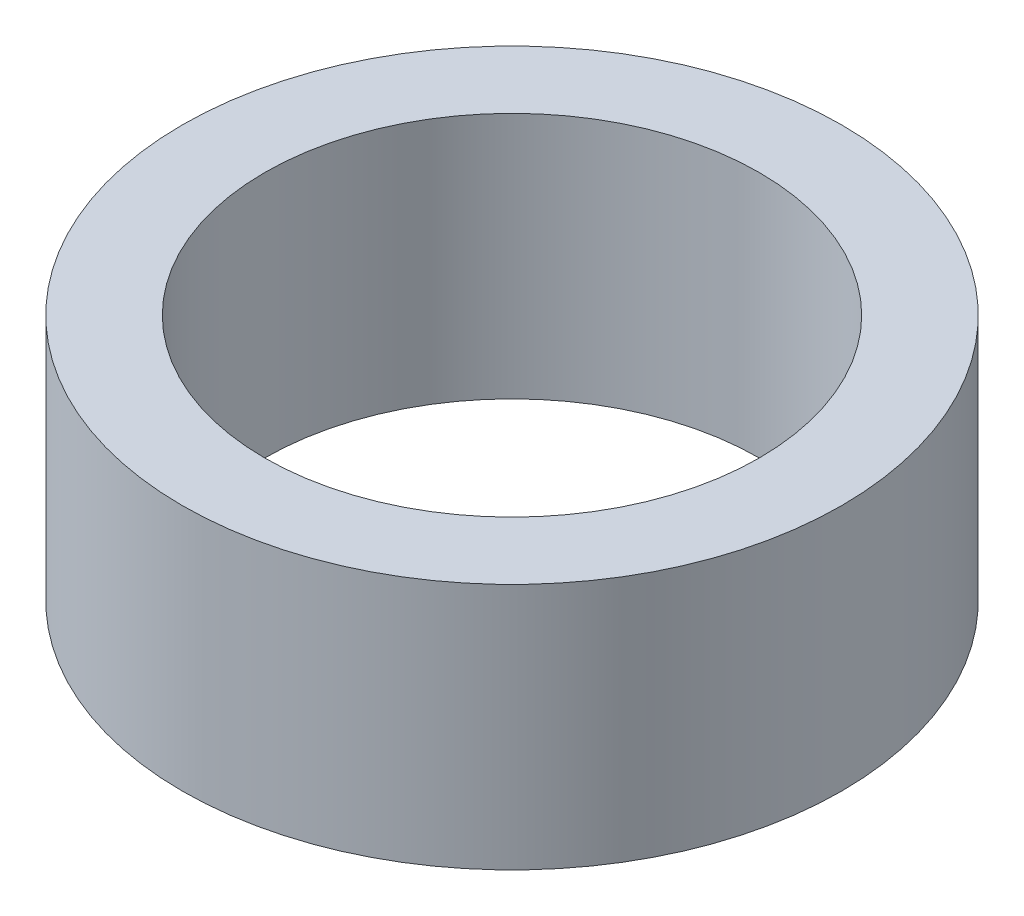
ISO-10303-21;
HEADER;
FILE_DESCRIPTION(('STEP AP214'),'2;1');
FILE_NAME('part.step','',(''),(''),'','','');
FILE_SCHEMA(('AUTOMOTIVE_DESIGN { 1 0 10303 214 1 1 1 1 }'));
ENDSEC;
DATA;
#1=APPLICATION_CONTEXT('core data for automotive mechanical design processes');
#2=APPLICATION_PROTOCOL_DEFINITION('international standard','automotive_design',2000,#1);
#3=PRODUCT_CONTEXT('',#1,'mechanical');
#4=PRODUCT('Part','Part','',(#3));
#5=PRODUCT_RELATED_PRODUCT_CATEGORY('part','',(#4));
#6=PRODUCT_DEFINITION_FORMATION('','',#4);
#7=PRODUCT_DEFINITION_CONTEXT('part definition',#1,'design');
#8=PRODUCT_DEFINITION('design','',#6,#7);
#9=PRODUCT_DEFINITION_SHAPE('','',#8);
#10=(LENGTH_UNIT() NAMED_UNIT(*) SI_UNIT(.MILLI.,.METRE.));
#11=(NAMED_UNIT(*) PLANE_ANGLE_UNIT() SI_UNIT($,.RADIAN.));
#12=(NAMED_UNIT(*) SI_UNIT($,.STERADIAN.) SOLID_ANGLE_UNIT());
#13=UNCERTAINTY_MEASURE_WITH_UNIT(LENGTH_MEASURE(1.E-05),#10,'distance_accuracy_value','');
#14=(GEOMETRIC_REPRESENTATION_CONTEXT(3) GLOBAL_UNCERTAINTY_ASSIGNED_CONTEXT((#13)) GLOBAL_UNIT_ASSIGNED_CONTEXT((#10,
#11,#12)) REPRESENTATION_CONTEXT('',''));
#15=CARTESIAN_POINT('',(0.,0.,0.));
#16=DIRECTION('',(0.,0.,1.));
#17=DIRECTION('',(1.,0.,0.));
#18=AXIS2_PLACEMENT_3D('',#15,#16,#17);
#19=CARTESIAN_POINT('',(0.,2.25,0.));
#20=DIRECTION('',(0.,1.,0.));
#21=DIRECTION('',(0.,0.,1.));
#22=AXIS2_PLACEMENT_3D('',#19,#20,#21);
#23=PLANE('',#22);
#24=CARTESIAN_POINT('',(0.,2.25,0.));
#25=DIRECTION('',(0.,1.,0.));
#26=DIRECTION('',(0.,0.,1.));
#27=AXIS2_PLACEMENT_3D('',#24,#25,#26);
#28=CIRCLE('',#27,3.);
#29=CARTESIAN_POINT('',(0.,2.25,3.));
#30=VERTEX_POINT('',#29);
#31=EDGE_CURVE('E10',#30,#30,#28,.T.);
#32=ORIENTED_EDGE('',*,*,#31,.T.);
#33=EDGE_LOOP('',(#32));
#34=FACE_BOUND('',#33,.T.);
#35=CARTESIAN_POINT('',(0.,2.25,0.));
#36=DIRECTION('',(0.,1.,0.));
#37=DIRECTION('',(0.,0.,1.));
#38=AXIS2_PLACEMENT_3D('',#35,#36,#37);
#39=CIRCLE('',#38,2.25);
#40=CARTESIAN_POINT('',(0.,2.25,2.25));
#41=VERTEX_POINT('',#40);
#42=EDGE_CURVE('E50',#41,#41,#39,.T.);
#43=ORIENTED_EDGE('',*,*,#42,.F.);
#44=EDGE_LOOP('',(#43));
#45=FACE_BOUND('',#44,.T.);
#46=ADVANCED_FACE('F39',(#34,#45),#23,.T.);
#47=CARTESIAN_POINT('',(0.,0.,0.));
#48=DIRECTION('',(0.,1.,0.));
#49=DIRECTION('',(0.,0.,1.));
#50=AXIS2_PLACEMENT_3D('',#47,#48,#49);
#51=PLANE('',#50);
#52=CARTESIAN_POINT('',(0.,0.,0.));
#53=DIRECTION('',(0.,1.,0.));
#54=DIRECTION('',(0.,0.,1.));
#55=AXIS2_PLACEMENT_3D('',#52,#53,#54);
#56=CIRCLE('',#55,3.);
#57=CARTESIAN_POINT('',(0.,0.,3.));
#58=VERTEX_POINT('',#57);
#59=EDGE_CURVE('E43',#58,#58,#56,.T.);
#60=ORIENTED_EDGE('',*,*,#59,.F.);
#61=EDGE_LOOP('',(#60));
#62=FACE_BOUND('',#61,.T.);
#63=CARTESIAN_POINT('',(0.,0.,0.));
#64=DIRECTION('',(0.,1.,0.));
#65=DIRECTION('',(0.,0.,1.));
#66=AXIS2_PLACEMENT_3D('',#63,#64,#65);
#67=CIRCLE('',#66,2.25);
#68=CARTESIAN_POINT('',(0.,0.,2.25));
#69=VERTEX_POINT('',#68);
#70=EDGE_CURVE('E52',#69,#69,#67,.T.);
#71=ORIENTED_EDGE('',*,*,#70,.T.);
#72=EDGE_LOOP('',(#71));
#73=FACE_BOUND('',#72,.T.);
#74=ADVANCED_FACE('F62',(#62,#73),#51,.F.);
#75=CARTESIAN_POINT('',(0.,2.25,0.));
#76=DIRECTION('',(0.,-1.,0.));
#77=DIRECTION('',(0.,0.,-1.));
#78=AXIS2_PLACEMENT_3D('',#75,#76,#77);
#79=CYLINDRICAL_SURFACE('',#78,3.);
#80=ORIENTED_EDGE('',*,*,#31,.F.);
#81=EDGE_LOOP('',(#80));
#82=FACE_BOUND('',#81,.T.);
#83=ORIENTED_EDGE('',*,*,#59,.T.);
#84=EDGE_LOOP('',(#83));
#85=FACE_BOUND('',#84,.T.);
#86=ADVANCED_FACE('F41',(#82,#85),#79,.T.);
#87=CARTESIAN_POINT('',(0.,2.25,0.));
#88=DIRECTION('',(0.,-1.,0.));
#89=DIRECTION('',(0.,0.,-1.));
#90=AXIS2_PLACEMENT_3D('',#87,#88,#89);
#91=CYLINDRICAL_SURFACE('',#90,2.25);
#92=ORIENTED_EDGE('',*,*,#42,.T.);
#93=EDGE_LOOP('',(#92));
#94=FACE_BOUND('',#93,.T.);
#95=ORIENTED_EDGE('',*,*,#70,.F.);
#96=EDGE_LOOP('',(#95));
#97=FACE_BOUND('',#96,.T.);
#98=ADVANCED_FACE('F58',(#94,#97),#91,.F.);
#99=CLOSED_SHELL('',(#46,#74,#86,#98));
#100=MANIFOLD_SOLID_BREP('B2',#99);
#101=ADVANCED_BREP_SHAPE_REPRESENTATION('',(#18,#100),#14);
#102=SHAPE_DEFINITION_REPRESENTATION(#9,#101);
ENDSEC;
END-ISO-10303-21;
